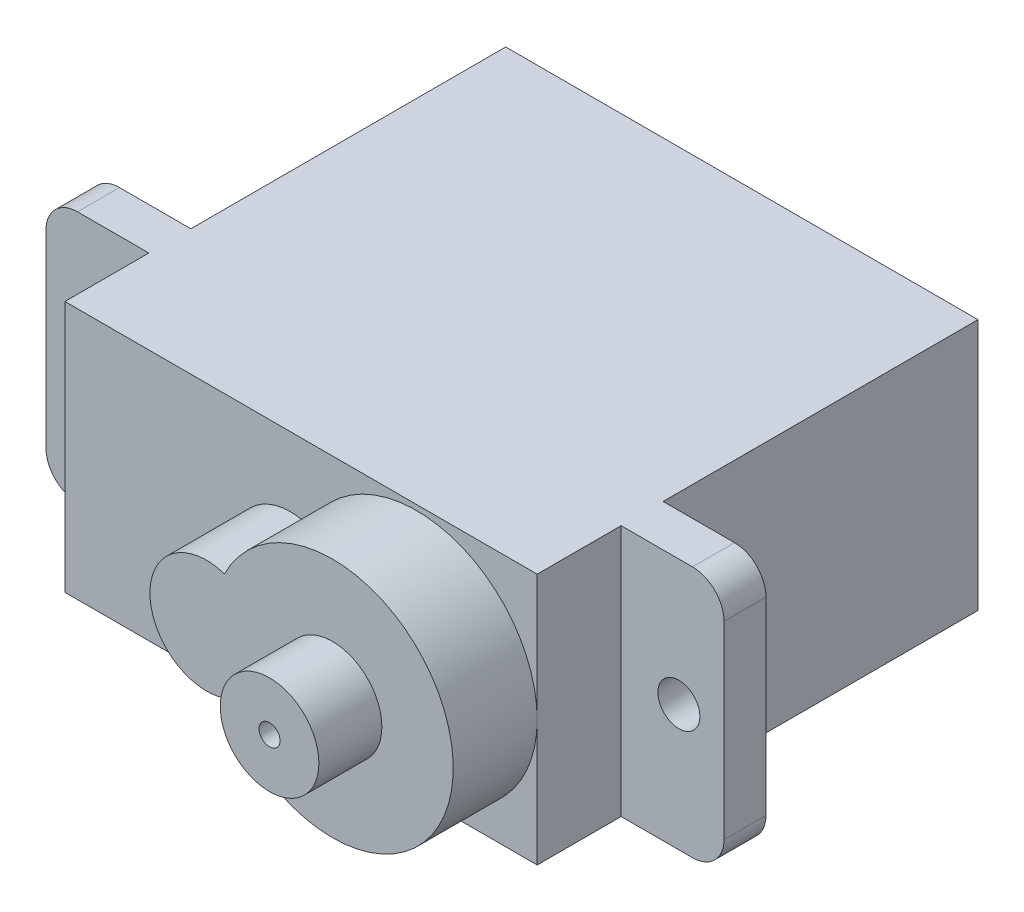
ISO-10303-21;
HEADER;
FILE_DESCRIPTION(('STEP AP214'),'2;1');
FILE_NAME('part.step','',(''),(''),'','','');
FILE_SCHEMA(('AUTOMOTIVE_DESIGN { 1 0 10303 214 1 1 1 1 }'));
ENDSEC;
DATA;
#1=APPLICATION_CONTEXT('core data for automotive mechanical design processes');
#2=APPLICATION_PROTOCOL_DEFINITION('international standard','automotive_design',2000,#1);
#3=PRODUCT_CONTEXT('',#1,'mechanical');
#4=PRODUCT('Part','Part','',(#3));
#5=PRODUCT_RELATED_PRODUCT_CATEGORY('part','',(#4));
#6=PRODUCT_DEFINITION_FORMATION('','',#4);
#7=PRODUCT_DEFINITION_CONTEXT('part definition',#1,'design');
#8=PRODUCT_DEFINITION('design','',#6,#7);
#9=PRODUCT_DEFINITION_SHAPE('','',#8);
#10=(LENGTH_UNIT() NAMED_UNIT(*) SI_UNIT(.MILLI.,.METRE.));
#11=(NAMED_UNIT(*) PLANE_ANGLE_UNIT() SI_UNIT($,.RADIAN.));
#12=(NAMED_UNIT(*) SI_UNIT($,.STERADIAN.) SOLID_ANGLE_UNIT());
#13=UNCERTAINTY_MEASURE_WITH_UNIT(LENGTH_MEASURE(1.E-05),#10,'distance_accuracy_value','');
#14=(GEOMETRIC_REPRESENTATION_CONTEXT(3) GLOBAL_UNCERTAINTY_ASSIGNED_CONTEXT((#13)) GLOBAL_UNIT_ASSIGNED_CONTEXT((#10,
#11,#12)) REPRESENTATION_CONTEXT('',''));
#15=CARTESIAN_POINT('',(0.,0.,0.));
#16=DIRECTION('',(0.,0.,1.));
#17=DIRECTION('',(1.,0.,0.));
#18=AXIS2_PLACEMENT_3D('',#15,#16,#17);
#19=CARTESIAN_POINT('',(-11.25,6.,10.5));
#20=DIRECTION('',(0.,0.,-1.));
#21=DIRECTION('',(-1.,0.,0.));
#22=AXIS2_PLACEMENT_3D('',#19,#20,#21);
#23=PLANE('',#22);
#24=CARTESIAN_POINT('',(-0.5,0.,10.5));
#25=DIRECTION('',(0.,0.,1.));
#26=DIRECTION('',(1.,0.,0.));
#27=AXIS2_PLACEMENT_3D('',#24,#25,#26);
#28=CIRCLE('',#27,2.7);
#29=CARTESIAN_POINT('',(0.352291666666666,2.5619521687437,10.5));
#30=VERTEX_POINT('',#29);
#31=CARTESIAN_POINT('',(0.352291666666666,-2.5619521687437,10.5));
#32=VERTEX_POINT('',#31);
#33=EDGE_CURVE('E171',#30,#32,#28,.T.);
#34=ORIENTED_EDGE('',*,*,#33,.F.);
#35=CARTESIAN_POINT('',(5.5,0.,10.5));
#36=DIRECTION('',(0.,0.,1.));
#37=DIRECTION('',(1.,0.,0.));
#38=AXIS2_PLACEMENT_3D('',#35,#36,#37);
#39=CIRCLE('',#38,5.75);
#40=CARTESIAN_POINT('',(11.25,0.,10.5));
#41=VERTEX_POINT('',#40);
#42=EDGE_CURVE('E178',#41,#30,#39,.T.);
#43=ORIENTED_EDGE('',*,*,#42,.F.);
#44=DIRECTION('',(0.,-1.,0.));
#45=VECTOR('',#44,1.);
#46=CARTESIAN_POINT('',(11.25,6.,10.5));
#47=LINE('',#46,#45);
#48=CARTESIAN_POINT('',(11.25,6.,10.5));
#49=VERTEX_POINT('',#48);
#50=EDGE_CURVE('E248',#49,#41,#47,.T.);
#51=ORIENTED_EDGE('',*,*,#50,.F.);
#52=DIRECTION('',(1.,0.,0.));
#53=VECTOR('',#52,1.);
#54=CARTESIAN_POINT('',(-11.25,6.,10.5));
#55=LINE('',#54,#53);
#56=CARTESIAN_POINT('',(-11.25,6.,10.5));
#57=VERTEX_POINT('',#56);
#58=EDGE_CURVE('E209',#57,#49,#55,.T.);
#59=ORIENTED_EDGE('',*,*,#58,.F.);
#60=DIRECTION('',(0.,-1.,0.));
#61=VECTOR('',#60,1.);
#62=CARTESIAN_POINT('',(-11.25,6.,10.5));
#63=LINE('',#62,#61);
#64=CARTESIAN_POINT('',(-11.25,-6.,10.5));
#65=VERTEX_POINT('',#64);
#66=EDGE_CURVE('E251',#57,#65,#63,.T.);
#67=ORIENTED_EDGE('',*,*,#66,.T.);
#68=DIRECTION('',(1.,0.,0.));
#69=VECTOR('',#68,1.);
#70=CARTESIAN_POINT('',(-11.25,-6.,10.5));
#71=LINE('',#70,#69);
#72=CARTESIAN_POINT('',(11.25,-6.,10.5));
#73=VERTEX_POINT('',#72);
#74=EDGE_CURVE('E229',#65,#73,#71,.T.);
#75=ORIENTED_EDGE('',*,*,#74,.T.);
#76=EDGE_CURVE('E247',#41,#73,#47,.T.);
#77=ORIENTED_EDGE('',*,*,#76,.F.);
#78=EDGE_CURVE('E188',#32,#41,#39,.T.);
#79=ORIENTED_EDGE('',*,*,#78,.F.);
#80=EDGE_LOOP('',(#34,#43,#51,#59,#67,#75,#77,#79));
#81=FACE_BOUND('',#80,.T.);
#82=ADVANCED_FACE('F33',(#81),#23,.F.);
#83=CARTESIAN_POINT('',(5.5,0.,14.5));
#84=DIRECTION('',(0.,0.,-1.));
#85=DIRECTION('',(-1.,0.,0.));
#86=AXIS2_PLACEMENT_3D('',#83,#84,#85);
#87=CYLINDRICAL_SURFACE('',#86,5.75);
#88=DIRECTION('',(0.,0.,-1.));
#89=VECTOR('',#88,1.);
#90=CARTESIAN_POINT('',(0.352291666666666,2.5619521687437,12.5));
#91=LINE('',#90,#89);
#92=CARTESIAN_POINT('',(0.352291666666666,2.5619521687437,14.5));
#93=VERTEX_POINT('',#92);
#94=EDGE_CURVE('E163',#93,#30,#91,.T.);
#95=ORIENTED_EDGE('',*,*,#94,.F.);
#96=CARTESIAN_POINT('',(5.5,0.,14.5));
#97=DIRECTION('',(0.,0.,1.));
#98=DIRECTION('',(1.,0.,0.));
#99=AXIS2_PLACEMENT_3D('',#96,#97,#98);
#100=CIRCLE('',#99,5.75);
#101=CARTESIAN_POINT('',(0.352291666666666,-2.5619521687437,14.5));
#102=VERTEX_POINT('',#101);
#103=EDGE_CURVE('E176',#102,#93,#100,.T.);
#104=ORIENTED_EDGE('',*,*,#103,.F.);
#105=DIRECTION('',(0.,0.,-1.));
#106=VECTOR('',#105,1.);
#107=CARTESIAN_POINT('',(0.352291666666666,-2.5619521687437,12.5));
#108=LINE('',#107,#106);
#109=EDGE_CURVE('E166',#32,#102,#108,.F.);
#110=ORIENTED_EDGE('',*,*,#109,.F.);
#111=ORIENTED_EDGE('',*,*,#78,.T.);
#112=ORIENTED_EDGE('',*,*,#42,.T.);
#113=EDGE_LOOP('',(#95,#104,#110,#111,#112));
#114=FACE_BOUND('',#113,.T.);
#115=ADVANCED_FACE('F175',(#114),#87,.T.);
#116=CARTESIAN_POINT('',(5.5,0.,14.5));
#117=DIRECTION('',(0.,0.,1.));
#118=DIRECTION('',(1.,0.,0.));
#119=AXIS2_PLACEMENT_3D('',#116,#117,#118);
#120=PLANE('',#119);
#121=CARTESIAN_POINT('',(-0.5,0.,14.5));
#122=DIRECTION('',(0.,0.,1.));
#123=DIRECTION('',(1.,0.,0.));
#124=AXIS2_PLACEMENT_3D('',#121,#122,#123);
#125=CIRCLE('',#124,2.7);
#126=EDGE_CURVE('E160',#93,#102,#125,.T.);
#127=ORIENTED_EDGE('',*,*,#126,.T.);
#128=ORIENTED_EDGE('',*,*,#103,.T.);
#129=EDGE_LOOP('',(#127,#128));
#130=FACE_BOUND('',#129,.T.);
#131=CARTESIAN_POINT('',(5.5,0.,14.5));
#132=DIRECTION('',(0.,0.,1.));
#133=DIRECTION('',(1.,0.,0.));
#134=AXIS2_PLACEMENT_3D('',#131,#132,#133);
#135=CIRCLE('',#134,2.35);
#136=CARTESIAN_POINT('',(7.85,0.,14.5));
#137=VERTEX_POINT('',#136);
#138=EDGE_CURVE('E191',#137,#137,#135,.T.);
#139=ORIENTED_EDGE('',*,*,#138,.F.);
#140=EDGE_LOOP('',(#139));
#141=FACE_BOUND('',#140,.T.);
#142=ADVANCED_FACE('F181',(#130,#141),#120,.T.);
#143=CARTESIAN_POINT('',(11.25,6.,4.5));
#144=DIRECTION('',(-1.,0.,0.));
#145=DIRECTION('',(0.,0.,1.));
#146=AXIS2_PLACEMENT_3D('',#143,#144,#145);
#147=PLANE('',#146);
#148=DIRECTION('',(0.,0.,-1.));
#149=VECTOR('',#148,1.);
#150=CARTESIAN_POINT('',(11.25,-6.,4.5));
#151=LINE('',#150,#149);
#152=CARTESIAN_POINT('',(11.25,-6.,4.5));
#153=VERTEX_POINT('',#152);
#154=CARTESIAN_POINT('',(11.25,-6.,-10.5));
#155=VERTEX_POINT('',#154);
#156=EDGE_CURVE('E183',#153,#155,#151,.T.);
#157=ORIENTED_EDGE('',*,*,#156,.T.);
#158=DIRECTION('',(0.,-1.,0.));
#159=VECTOR('',#158,1.);
#160=CARTESIAN_POINT('',(11.25,6.,-10.5));
#161=LINE('',#160,#159);
#162=CARTESIAN_POINT('',(11.25,6.,-10.5));
#163=VERTEX_POINT('',#162);
#164=EDGE_CURVE('E269',#163,#155,#161,.T.);
#165=ORIENTED_EDGE('',*,*,#164,.F.);
#166=DIRECTION('',(0.,0.,-1.));
#167=VECTOR('',#166,1.);
#168=CARTESIAN_POINT('',(11.25,6.,4.5));
#169=LINE('',#168,#167);
#170=CARTESIAN_POINT('',(11.25,6.,4.5));
#171=VERTEX_POINT('',#170);
#172=EDGE_CURVE('E194',#171,#163,#169,.T.);
#173=ORIENTED_EDGE('',*,*,#172,.F.);
#174=DIRECTION('',(0.,-1.,0.));
#175=VECTOR('',#174,1.);
#176=CARTESIAN_POINT('',(11.25,6.,4.5));
#177=LINE('',#176,#175);
#178=EDGE_CURVE('E217',#171,#153,#177,.T.);
#179=ORIENTED_EDGE('',*,*,#178,.T.);
#180=EDGE_LOOP('',(#157,#165,#173,#179));
#181=FACE_BOUND('',#180,.T.);
#182=ADVANCED_FACE('F376',(#181),#147,.F.);
#183=CARTESIAN_POINT('',(11.25,6.,-10.5));
#184=DIRECTION('',(0.,0.,1.));
#185=DIRECTION('',(1.,0.,0.));
#186=AXIS2_PLACEMENT_3D('',#183,#184,#185);
#187=PLANE('',#186);
#188=DIRECTION('',(-1.,0.,0.));
#189=VECTOR('',#188,1.);
#190=CARTESIAN_POINT('',(11.25,-6.,-10.5));
#191=LINE('',#190,#189);
#192=CARTESIAN_POINT('',(-11.25,-6.,-10.5));
#193=VERTEX_POINT('',#192);
#194=EDGE_CURVE('E186',#155,#193,#191,.T.);
#195=ORIENTED_EDGE('',*,*,#194,.T.);
#196=DIRECTION('',(0.,-1.,0.));
#197=VECTOR('',#196,1.);
#198=CARTESIAN_POINT('',(-11.25,6.,-10.5));
#199=LINE('',#198,#197);
#200=CARTESIAN_POINT('',(-11.25,6.,-10.5));
#201=VERTEX_POINT('',#200);
#202=EDGE_CURVE('E266',#201,#193,#199,.T.);
#203=ORIENTED_EDGE('',*,*,#202,.F.);
#204=DIRECTION('',(-1.,0.,0.));
#205=VECTOR('',#204,1.);
#206=CARTESIAN_POINT('',(11.25,6.,-10.5));
#207=LINE('',#206,#205);
#208=EDGE_CURVE('E197',#163,#201,#207,.T.);
#209=ORIENTED_EDGE('',*,*,#208,.F.);
#210=ORIENTED_EDGE('',*,*,#164,.T.);
#211=EDGE_LOOP('',(#195,#203,#209,#210));
#212=FACE_BOUND('',#211,.T.);
#213=ADVANCED_FACE('F372',(#212),#187,.F.);
#214=CARTESIAN_POINT('',(-11.25,6.,-10.5));
#215=DIRECTION('',(1.,0.,0.));
#216=DIRECTION('',(0.,0.,-1.));
#217=AXIS2_PLACEMENT_3D('',#214,#215,#216);
#218=PLANE('',#217);
#219=DIRECTION('',(0.,0.,1.));
#220=VECTOR('',#219,1.);
#221=CARTESIAN_POINT('',(-11.25,-6.,-10.5));
#222=LINE('',#221,#220);
#223=CARTESIAN_POINT('',(-11.25,-6.,4.5));
#224=VERTEX_POINT('',#223);
#225=EDGE_CURVE('E220',#193,#224,#222,.T.);
#226=ORIENTED_EDGE('',*,*,#225,.T.);
#227=DIRECTION('',(0.,-1.,0.));
#228=VECTOR('',#227,1.);
#229=CARTESIAN_POINT('',(-11.25,6.,4.5));
#230=LINE('',#229,#228);
#231=CARTESIAN_POINT('',(-11.25,6.,4.5));
#232=VERTEX_POINT('',#231);
#233=EDGE_CURVE('E263',#232,#224,#230,.T.);
#234=ORIENTED_EDGE('',*,*,#233,.F.);
#235=DIRECTION('',(0.,0.,1.));
#236=VECTOR('',#235,1.);
#237=CARTESIAN_POINT('',(-11.25,6.,-10.5));
#238=LINE('',#237,#236);
#239=EDGE_CURVE('E200',#201,#232,#238,.T.);
#240=ORIENTED_EDGE('',*,*,#239,.F.);
#241=ORIENTED_EDGE('',*,*,#202,.T.);
#242=EDGE_LOOP('',(#226,#234,#240,#241));
#243=FACE_BOUND('',#242,.T.);
#244=ADVANCED_FACE('F368',(#243),#218,.F.);
#245=CARTESIAN_POINT('',(-11.25,6.,4.5));
#246=DIRECTION('',(0.,0.,1.));
#247=DIRECTION('',(1.,0.,0.));
#248=AXIS2_PLACEMENT_3D('',#245,#246,#247);
#249=PLANE('',#248);
#250=CARTESIAN_POINT('',(-14.,0.,4.5));
#251=DIRECTION('',(0.,0.,1.));
#252=DIRECTION('',(1.,0.,0.));
#253=AXIS2_PLACEMENT_3D('',#250,#251,#252);
#254=CIRCLE('',#253,1.);
#255=CARTESIAN_POINT('',(-13.,0.,4.5));
#256=VERTEX_POINT('',#255);
#257=EDGE_CURVE('E465',#256,#256,#254,.T.);
#258=ORIENTED_EDGE('',*,*,#257,.T.);
#259=EDGE_LOOP('',(#258));
#260=FACE_BOUND('',#259,.T.);
#261=DIRECTION('',(0.,-1.,0.));
#262=VECTOR('',#261,1.);
#263=CARTESIAN_POINT('',(-16.15,6.,4.5));
#264=LINE('',#263,#262);
#265=CARTESIAN_POINT('',(-16.15,4.5,4.5));
#266=VERTEX_POINT('',#265);
#267=CARTESIAN_POINT('',(-16.15,-4.5,4.5));
#268=VERTEX_POINT('',#267);
#269=EDGE_CURVE('E260',#266,#268,#264,.T.);
#270=ORIENTED_EDGE('',*,*,#269,.F.);
#271=CARTESIAN_POINT('',(-14.65,4.5,4.5));
#272=DIRECTION('',(0.,0.,1.));
#273=DIRECTION('',(1.,0.,0.));
#274=AXIS2_PLACEMENT_3D('',#271,#272,#273);
#275=CIRCLE('',#274,1.5);
#276=CARTESIAN_POINT('',(-14.65,6.,4.5));
#277=VERTEX_POINT('',#276);
#278=EDGE_CURVE('E297',#266,#277,#275,.F.);
#279=ORIENTED_EDGE('',*,*,#278,.T.);
#280=DIRECTION('',(-1.,0.,0.));
#281=VECTOR('',#280,1.);
#282=CARTESIAN_POINT('',(-11.25,6.,4.5));
#283=LINE('',#282,#281);
#284=EDGE_CURVE('E202',#232,#277,#283,.T.);
#285=ORIENTED_EDGE('',*,*,#284,.F.);
#286=ORIENTED_EDGE('',*,*,#233,.T.);
#287=DIRECTION('',(-1.,0.,0.));
#288=VECTOR('',#287,1.);
#289=CARTESIAN_POINT('',(-11.25,-6.,4.5));
#290=LINE('',#289,#288);
#291=CARTESIAN_POINT('',(-14.65,-6.,4.5));
#292=VERTEX_POINT('',#291);
#293=EDGE_CURVE('E222',#224,#292,#290,.T.);
#294=ORIENTED_EDGE('',*,*,#293,.T.);
#295=CARTESIAN_POINT('',(-14.65,-4.5,4.5));
#296=DIRECTION('',(0.,0.,1.));
#297=DIRECTION('',(1.,0.,0.));
#298=AXIS2_PLACEMENT_3D('',#295,#296,#297);
#299=CIRCLE('',#298,1.5);
#300=EDGE_CURVE('E295',#292,#268,#299,.F.);
#301=ORIENTED_EDGE('',*,*,#300,.T.);
#302=EDGE_LOOP('',(#270,#279,#285,#286,#294,#301));
#303=FACE_BOUND('',#302,.T.);
#304=ADVANCED_FACE('F364',(#260,#303),#249,.F.);
#305=CARTESIAN_POINT('',(-16.15,6.,4.5));
#306=DIRECTION('',(1.,0.,0.));
#307=DIRECTION('',(0.,0.,-1.));
#308=AXIS2_PLACEMENT_3D('',#305,#306,#307);
#309=PLANE('',#308);
#310=DIRECTION('',(0.,-1.,0.));
#311=VECTOR('',#310,1.);
#312=CARTESIAN_POINT('',(-16.15,6.,6.5));
#313=LINE('',#312,#311);
#314=CARTESIAN_POINT('',(-16.15,4.5,6.5));
#315=VERTEX_POINT('',#314);
#316=CARTESIAN_POINT('',(-16.15,-4.5,6.5));
#317=VERTEX_POINT('',#316);
#318=EDGE_CURVE('E257',#315,#317,#313,.T.);
#319=ORIENTED_EDGE('',*,*,#318,.F.);
#320=DIRECTION('',(0.,0.,1.));
#321=VECTOR('',#320,1.);
#322=CARTESIAN_POINT('',(-16.15,4.5,4.5));
#323=LINE('',#322,#321);
#324=EDGE_CURVE('E293',#315,#266,#323,.F.);
#325=ORIENTED_EDGE('',*,*,#324,.T.);
#326=ORIENTED_EDGE('',*,*,#269,.T.);
#327=DIRECTION('',(0.,0.,1.));
#328=VECTOR('',#327,1.);
#329=CARTESIAN_POINT('',(-16.15,-4.5,4.5));
#330=LINE('',#329,#328);
#331=EDGE_CURVE('E290',#268,#317,#330,.T.);
#332=ORIENTED_EDGE('',*,*,#331,.T.);
#333=EDGE_LOOP('',(#319,#325,#326,#332));
#334=FACE_BOUND('',#333,.T.);
#335=ADVANCED_FACE('F360',(#334),#309,.F.);
#336=CARTESIAN_POINT('',(-16.15,6.,6.5));
#337=DIRECTION('',(0.,0.,-1.));
#338=DIRECTION('',(-1.,0.,0.));
#339=AXIS2_PLACEMENT_3D('',#336,#337,#338);
#340=PLANE('',#339);
#341=CARTESIAN_POINT('',(-14.,0.,6.50000000000001));
#342=DIRECTION('',(0.,0.,1.));
#343=DIRECTION('',(1.,0.,0.));
#344=AXIS2_PLACEMENT_3D('',#341,#342,#343);
#345=CIRCLE('',#344,1.);
#346=CARTESIAN_POINT('',(-13.,0.,6.50000000000001));
#347=VERTEX_POINT('',#346);
#348=EDGE_CURVE('E279',#347,#347,#345,.T.);
#349=ORIENTED_EDGE('',*,*,#348,.F.);
#350=EDGE_LOOP('',(#349));
#351=FACE_BOUND('',#350,.T.);
#352=DIRECTION('',(1.,0.,0.));
#353=VECTOR('',#352,1.);
#354=CARTESIAN_POINT('',(-16.15,6.,6.5));
#355=LINE('',#354,#353);
#356=CARTESIAN_POINT('',(-14.65,6.,6.5));
#357=VERTEX_POINT('',#356);
#358=CARTESIAN_POINT('',(-11.25,6.,6.5));
#359=VERTEX_POINT('',#358);
#360=EDGE_CURVE('E205',#357,#359,#355,.T.);
#361=ORIENTED_EDGE('',*,*,#360,.F.);
#362=CARTESIAN_POINT('',(-14.65,4.5,6.5));
#363=DIRECTION('',(0.,0.,-1.));
#364=DIRECTION('',(-1.,0.,0.));
#365=AXIS2_PLACEMENT_3D('',#362,#363,#364);
#366=CIRCLE('',#365,1.5);
#367=EDGE_CURVE('E288',#357,#315,#366,.F.);
#368=ORIENTED_EDGE('',*,*,#367,.T.);
#369=ORIENTED_EDGE('',*,*,#318,.T.);
#370=CARTESIAN_POINT('',(-14.65,-4.5,6.5));
#371=DIRECTION('',(0.,0.,-1.));
#372=DIRECTION('',(-1.,0.,0.));
#373=AXIS2_PLACEMENT_3D('',#370,#371,#372);
#374=CIRCLE('',#373,1.5);
#375=CARTESIAN_POINT('',(-14.65,-6.,6.5));
#376=VERTEX_POINT('',#375);
#377=EDGE_CURVE('E286',#317,#376,#374,.F.);
#378=ORIENTED_EDGE('',*,*,#377,.T.);
#379=DIRECTION('',(1.,0.,0.));
#380=VECTOR('',#379,1.);
#381=CARTESIAN_POINT('',(-16.15,-6.,6.5));
#382=LINE('',#381,#380);
#383=CARTESIAN_POINT('',(-11.25,-6.,6.5));
#384=VERTEX_POINT('',#383);
#385=EDGE_CURVE('E225',#376,#384,#382,.T.);
#386=ORIENTED_EDGE('',*,*,#385,.T.);
#387=DIRECTION('',(0.,-1.,0.));
#388=VECTOR('',#387,1.);
#389=CARTESIAN_POINT('',(-11.25,6.,6.5));
#390=LINE('',#389,#388);
#391=EDGE_CURVE('E254',#359,#384,#390,.T.);
#392=ORIENTED_EDGE('',*,*,#391,.F.);
#393=EDGE_LOOP('',(#361,#368,#369,#378,#386,#392));
#394=FACE_BOUND('',#393,.T.);
#395=ADVANCED_FACE('F356',(#351,#394),#340,.F.);
#396=CARTESIAN_POINT('',(-11.25,6.,6.5));
#397=DIRECTION('',(1.,0.,0.));
#398=DIRECTION('',(0.,0.,-1.));
#399=AXIS2_PLACEMENT_3D('',#396,#397,#398);
#400=PLANE('',#399);
#401=DIRECTION('',(0.,0.,1.));
#402=VECTOR('',#401,1.);
#403=CARTESIAN_POINT('',(-11.25,-6.,6.5));
#404=LINE('',#403,#402);
#405=EDGE_CURVE('E227',#384,#65,#404,.T.);
#406=ORIENTED_EDGE('',*,*,#405,.T.);
#407=ORIENTED_EDGE('',*,*,#66,.F.);
#408=DIRECTION('',(0.,0.,1.));
#409=VECTOR('',#408,1.);
#410=CARTESIAN_POINT('',(-11.25,6.,6.5));
#411=LINE('',#410,#409);
#412=EDGE_CURVE('E207',#359,#57,#411,.T.);
#413=ORIENTED_EDGE('',*,*,#412,.F.);
#414=ORIENTED_EDGE('',*,*,#391,.T.);
#415=EDGE_LOOP('',(#406,#407,#413,#414));
#416=FACE_BOUND('',#415,.T.);
#417=ADVANCED_FACE('F353',(#416),#400,.F.);
#418=CARTESIAN_POINT('',(11.25,6.,10.5));
#419=DIRECTION('',(-1.,0.,0.));
#420=DIRECTION('',(0.,0.,1.));
#421=AXIS2_PLACEMENT_3D('',#418,#419,#420);
#422=PLANE('',#421);
#423=DIRECTION('',(0.,0.,-1.));
#424=VECTOR('',#423,1.);
#425=CARTESIAN_POINT('',(11.25,-6.,10.5));
#426=LINE('',#425,#424);
#427=CARTESIAN_POINT('',(11.25,-6.,6.5));
#428=VERTEX_POINT('',#427);
#429=EDGE_CURVE('E232',#73,#428,#426,.T.);
#430=ORIENTED_EDGE('',*,*,#429,.T.);
#431=DIRECTION('',(0.,-1.,0.));
#432=VECTOR('',#431,1.);
#433=CARTESIAN_POINT('',(11.25,6.,6.5));
#434=LINE('',#433,#432);
#435=CARTESIAN_POINT('',(11.25,6.,6.5));
#436=VERTEX_POINT('',#435);
#437=EDGE_CURVE('E244',#436,#428,#434,.T.);
#438=ORIENTED_EDGE('',*,*,#437,.F.);
#439=DIRECTION('',(0.,0.,-1.));
#440=VECTOR('',#439,1.);
#441=CARTESIAN_POINT('',(11.25,6.,10.5));
#442=LINE('',#441,#440);
#443=EDGE_CURVE('E211',#49,#436,#442,.T.);
#444=ORIENTED_EDGE('',*,*,#443,.F.);
#445=ORIENTED_EDGE('',*,*,#50,.T.);
#446=ORIENTED_EDGE('',*,*,#76,.T.);
#447=EDGE_LOOP('',(#430,#438,#444,#445,#446));
#448=FACE_BOUND('',#447,.T.);
#449=ADVANCED_FACE('F351',(#448),#422,.F.);
#450=CARTESIAN_POINT('',(11.25,6.,6.5));
#451=DIRECTION('',(0.,0.,-1.));
#452=DIRECTION('',(-1.,0.,0.));
#453=AXIS2_PLACEMENT_3D('',#450,#451,#452);
#454=PLANE('',#453);
#455=CARTESIAN_POINT('',(14.,0.,6.50000000000001));
#456=DIRECTION('',(0.,0.,1.));
#457=DIRECTION('',(1.,0.,0.));
#458=AXIS2_PLACEMENT_3D('',#455,#456,#457);
#459=CIRCLE('',#458,1.);
#460=CARTESIAN_POINT('',(15.,0.,6.50000000000001));
#461=VERTEX_POINT('',#460);
#462=EDGE_CURVE('E280',#461,#461,#459,.T.);
#463=ORIENTED_EDGE('',*,*,#462,.F.);
#464=EDGE_LOOP('',(#463));
#465=FACE_BOUND('',#464,.T.);
#466=DIRECTION('',(0.,-1.,0.));
#467=VECTOR('',#466,1.);
#468=CARTESIAN_POINT('',(16.15,6.,6.49999999999999));
#469=LINE('',#468,#467);
#470=CARTESIAN_POINT('',(16.15,4.5,6.49999999999999));
#471=VERTEX_POINT('',#470);
#472=CARTESIAN_POINT('',(16.15,-4.5,6.49999999999999));
#473=VERTEX_POINT('',#472);
#474=EDGE_CURVE('E242',#471,#473,#469,.T.);
#475=ORIENTED_EDGE('',*,*,#474,.F.);
#476=CARTESIAN_POINT('',(14.65,4.5,6.5));
#477=DIRECTION('',(0.,0.,-1.));
#478=DIRECTION('',(-1.,0.,0.));
#479=AXIS2_PLACEMENT_3D('',#476,#477,#478);
#480=CIRCLE('',#479,1.5);
#481=CARTESIAN_POINT('',(14.65,6.,6.5));
#482=VERTEX_POINT('',#481);
#483=EDGE_CURVE('E11',#471,#482,#480,.F.);
#484=ORIENTED_EDGE('',*,*,#483,.T.);
#485=DIRECTION('',(1.,0.,0.));
#486=VECTOR('',#485,1.);
#487=CARTESIAN_POINT('',(11.25,6.,6.5));
#488=LINE('',#487,#486);
#489=EDGE_CURVE('E213',#436,#482,#488,.T.);
#490=ORIENTED_EDGE('',*,*,#489,.F.);
#491=ORIENTED_EDGE('',*,*,#437,.T.);
#492=DIRECTION('',(1.,0.,0.));
#493=VECTOR('',#492,1.);
#494=CARTESIAN_POINT('',(11.25,-6.,6.5));
#495=LINE('',#494,#493);
#496=CARTESIAN_POINT('',(14.65,-6.,6.5));
#497=VERTEX_POINT('',#496);
#498=EDGE_CURVE('E234',#428,#497,#495,.T.);
#499=ORIENTED_EDGE('',*,*,#498,.T.);
#500=CARTESIAN_POINT('',(14.65,-4.5,6.5));
#501=DIRECTION('',(0.,0.,-1.));
#502=DIRECTION('',(-1.,0.,0.));
#503=AXIS2_PLACEMENT_3D('',#500,#501,#502);
#504=CIRCLE('',#503,1.5);
#505=EDGE_CURVE('E41',#497,#473,#504,.F.);
#506=ORIENTED_EDGE('',*,*,#505,.T.);
#507=EDGE_LOOP('',(#475,#484,#490,#491,#499,#506));
#508=FACE_BOUND('',#507,.T.);
#509=ADVANCED_FACE('F327',(#465,#508),#454,.F.);
#510=CARTESIAN_POINT('',(16.15,6.,6.49999999999999));
#511=DIRECTION('',(-1.,0.,0.));
#512=DIRECTION('',(0.,0.,1.));
#513=AXIS2_PLACEMENT_3D('',#510,#511,#512);
#514=PLANE('',#513);
#515=DIRECTION('',(0.,-1.,0.));
#516=VECTOR('',#515,1.);
#517=CARTESIAN_POINT('',(16.15,6.,4.49999999999999));
#518=LINE('',#517,#516);
#519=CARTESIAN_POINT('',(16.15,4.5,4.49999999999999));
#520=VERTEX_POINT('',#519);
#521=CARTESIAN_POINT('',(16.15,-4.5,4.49999999999999));
#522=VERTEX_POINT('',#521);
#523=EDGE_CURVE('E239',#520,#522,#518,.T.);
#524=ORIENTED_EDGE('',*,*,#523,.F.);
#525=DIRECTION('',(0.,0.,-1.));
#526=VECTOR('',#525,1.);
#527=CARTESIAN_POINT('',(16.15,4.5,6.49999999999999));
#528=LINE('',#527,#526);
#529=EDGE_CURVE('E54',#520,#471,#528,.F.);
#530=ORIENTED_EDGE('',*,*,#529,.T.);
#531=ORIENTED_EDGE('',*,*,#474,.T.);
#532=DIRECTION('',(0.,0.,-1.));
#533=VECTOR('',#532,1.);
#534=CARTESIAN_POINT('',(16.15,-4.5,6.49999999999999));
#535=LINE('',#534,#533);
#536=EDGE_CURVE('E307',#473,#522,#535,.T.);
#537=ORIENTED_EDGE('',*,*,#536,.T.);
#538=EDGE_LOOP('',(#524,#530,#531,#537));
#539=FACE_BOUND('',#538,.T.);
#540=ADVANCED_FACE('F311',(#539),#514,.F.);
#541=CARTESIAN_POINT('',(16.15,6.,4.49999999999999));
#542=DIRECTION('',(0.,0.,1.));
#543=DIRECTION('',(1.,0.,0.));
#544=AXIS2_PLACEMENT_3D('',#541,#542,#543);
#545=PLANE('',#544);
#546=CARTESIAN_POINT('',(14.,0.,4.5));
#547=DIRECTION('',(0.,0.,1.));
#548=DIRECTION('',(1.,0.,0.));
#549=AXIS2_PLACEMENT_3D('',#546,#547,#548);
#550=CIRCLE('',#549,1.);
#551=CARTESIAN_POINT('',(15.,0.,4.49999999999999));
#552=VERTEX_POINT('',#551);
#553=EDGE_CURVE('E276',#552,#552,#550,.T.);
#554=ORIENTED_EDGE('',*,*,#553,.T.);
#555=EDGE_LOOP('',(#554));
#556=FACE_BOUND('',#555,.T.);
#557=DIRECTION('',(-1.,0.,0.));
#558=VECTOR('',#557,1.);
#559=CARTESIAN_POINT('',(16.15,6.,4.49999999999999));
#560=LINE('',#559,#558);
#561=CARTESIAN_POINT('',(14.65,6.,4.5));
#562=VERTEX_POINT('',#561);
#563=EDGE_CURVE('E216',#562,#171,#560,.T.);
#564=ORIENTED_EDGE('',*,*,#563,.F.);
#565=CARTESIAN_POINT('',(14.65,4.5,4.5));
#566=DIRECTION('',(0.,0.,1.));
#567=DIRECTION('',(1.,0.,0.));
#568=AXIS2_PLACEMENT_3D('',#565,#566,#567);
#569=CIRCLE('',#568,1.5);
#570=EDGE_CURVE('E305',#562,#520,#569,.F.);
#571=ORIENTED_EDGE('',*,*,#570,.T.);
#572=ORIENTED_EDGE('',*,*,#523,.T.);
#573=CARTESIAN_POINT('',(14.65,-4.5,4.5));
#574=DIRECTION('',(0.,0.,1.));
#575=DIRECTION('',(1.,0.,0.));
#576=AXIS2_PLACEMENT_3D('',#573,#574,#575);
#577=CIRCLE('',#576,1.5);
#578=CARTESIAN_POINT('',(14.65,-6.,4.5));
#579=VERTEX_POINT('',#578);
#580=EDGE_CURVE('E303',#522,#579,#577,.F.);
#581=ORIENTED_EDGE('',*,*,#580,.T.);
#582=DIRECTION('',(-1.,0.,0.));
#583=VECTOR('',#582,1.);
#584=CARTESIAN_POINT('',(16.15,-6.,4.49999999999999));
#585=LINE('',#584,#583);
#586=EDGE_CURVE('E198',#579,#153,#585,.T.);
#587=ORIENTED_EDGE('',*,*,#586,.T.);
#588=ORIENTED_EDGE('',*,*,#178,.F.);
#589=EDGE_LOOP('',(#564,#571,#572,#581,#587,#588));
#590=FACE_BOUND('',#589,.T.);
#591=ADVANCED_FACE('F315',(#556,#590),#545,.F.);
#592=CARTESIAN_POINT('',(0.,6.,0.));
#593=DIRECTION('',(0.,1.,0.));
#594=DIRECTION('',(0.,0.,1.));
#595=AXIS2_PLACEMENT_3D('',#592,#593,#594);
#596=PLANE('',#595);
#597=ORIENTED_EDGE('',*,*,#284,.T.);
#598=DIRECTION('',(0.,0.,1.));
#599=VECTOR('',#598,1.);
#600=CARTESIAN_POINT('',(-14.65,6.,6.5));
#601=LINE('',#600,#599);
#602=EDGE_CURVE('E283',#277,#357,#601,.T.);
#603=ORIENTED_EDGE('',*,*,#602,.T.);
#604=ORIENTED_EDGE('',*,*,#360,.T.);
#605=ORIENTED_EDGE('',*,*,#412,.T.);
#606=ORIENTED_EDGE('',*,*,#58,.T.);
#607=ORIENTED_EDGE('',*,*,#443,.T.);
#608=ORIENTED_EDGE('',*,*,#489,.T.);
#609=DIRECTION('',(0.,0.,-1.));
#610=VECTOR('',#609,1.);
#611=CARTESIAN_POINT('',(14.65,6.,4.49999999999999));
#612=LINE('',#611,#610);
#613=EDGE_CURVE('E179',#482,#562,#612,.T.);
#614=ORIENTED_EDGE('',*,*,#613,.T.);
#615=ORIENTED_EDGE('',*,*,#563,.T.);
#616=ORIENTED_EDGE('',*,*,#172,.T.);
#617=ORIENTED_EDGE('',*,*,#208,.T.);
#618=ORIENTED_EDGE('',*,*,#239,.T.);
#619=EDGE_LOOP('',(#597,#603,#604,#605,#606,#607,#608,#614,#615,#616,#617,#618));
#620=FACE_BOUND('',#619,.T.);
#621=ADVANCED_FACE('F323',(#620),#596,.T.);
#622=CARTESIAN_POINT('',(0.,-6.,0.));
#623=DIRECTION('',(0.,1.,0.));
#624=DIRECTION('',(0.,0.,1.));
#625=AXIS2_PLACEMENT_3D('',#622,#623,#624);
#626=PLANE('',#625);
#627=ORIENTED_EDGE('',*,*,#385,.F.);
#628=DIRECTION('',(0.,0.,1.));
#629=VECTOR('',#628,1.);
#630=CARTESIAN_POINT('',(-14.65,-6.,0.));
#631=LINE('',#630,#629);
#632=EDGE_CURVE('E301',#376,#292,#631,.F.);
#633=ORIENTED_EDGE('',*,*,#632,.T.);
#634=ORIENTED_EDGE('',*,*,#293,.F.);
#635=ORIENTED_EDGE('',*,*,#225,.F.);
#636=ORIENTED_EDGE('',*,*,#194,.F.);
#637=ORIENTED_EDGE('',*,*,#156,.F.);
#638=ORIENTED_EDGE('',*,*,#586,.F.);
#639=DIRECTION('',(0.,0.,-1.));
#640=VECTOR('',#639,1.);
#641=CARTESIAN_POINT('',(14.65,-6.,0.));
#642=LINE('',#641,#640);
#643=EDGE_CURVE('E299',#579,#497,#642,.F.);
#644=ORIENTED_EDGE('',*,*,#643,.T.);
#645=ORIENTED_EDGE('',*,*,#498,.F.);
#646=ORIENTED_EDGE('',*,*,#429,.F.);
#647=ORIENTED_EDGE('',*,*,#74,.F.);
#648=ORIENTED_EDGE('',*,*,#405,.F.);
#649=EDGE_LOOP('',(#627,#633,#634,#635,#636,#637,#638,#644,#645,#646,#647,#648));
#650=FACE_BOUND('',#649,.T.);
#651=ADVANCED_FACE('F333',(#650),#626,.F.);
#652=CARTESIAN_POINT('',(5.5,0.,17.5));
#653=DIRECTION('',(0.,0.,1.));
#654=DIRECTION('',(1.,0.,0.));
#655=AXIS2_PLACEMENT_3D('',#652,#653,#654);
#656=PLANE('',#655);
#657=CARTESIAN_POINT('',(5.5,0.,17.5));
#658=DIRECTION('',(0.,0.,1.));
#659=DIRECTION('',(1.,0.,0.));
#660=AXIS2_PLACEMENT_3D('',#657,#658,#659);
#661=CIRCLE('',#660,2.35);
#662=CARTESIAN_POINT('',(7.85,0.,17.5));
#663=VERTEX_POINT('',#662);
#664=EDGE_CURVE('E470',#663,#663,#661,.T.);
#665=ORIENTED_EDGE('',*,*,#664,.T.);
#666=EDGE_LOOP('',(#665));
#667=FACE_BOUND('',#666,.T.);
#668=CARTESIAN_POINT('',(5.5,0.,17.5));
#669=DIRECTION('',(0.,0.,1.));
#670=DIRECTION('',(1.,0.,0.));
#671=AXIS2_PLACEMENT_3D('',#668,#669,#670);
#672=CIRCLE('',#671,0.499999999999999);
#673=CARTESIAN_POINT('',(6.,0.,17.5));
#674=VERTEX_POINT('',#673);
#675=EDGE_CURVE('E170',#674,#674,#672,.T.);
#676=ORIENTED_EDGE('',*,*,#675,.F.);
#677=EDGE_LOOP('',(#676));
#678=FACE_BOUND('',#677,.T.);
#679=ADVANCED_FACE('F430',(#667,#678),#656,.T.);
#680=CARTESIAN_POINT('',(5.5,0.,17.5));
#681=DIRECTION('',(0.,0.,-1.));
#682=DIRECTION('',(-1.,0.,0.));
#683=AXIS2_PLACEMENT_3D('',#680,#681,#682);
#684=CYLINDRICAL_SURFACE('',#683,2.35);
#685=ORIENTED_EDGE('',*,*,#664,.F.);
#686=EDGE_LOOP('',(#685));
#687=FACE_BOUND('',#686,.T.);
#688=ORIENTED_EDGE('',*,*,#138,.T.);
#689=EDGE_LOOP('',(#688));
#690=FACE_BOUND('',#689,.T.);
#691=ADVANCED_FACE('F438',(#687,#690),#684,.T.);
#692=CARTESIAN_POINT('',(5.5,0.,17.5));
#693=DIRECTION('',(0.,0.,-1.));
#694=DIRECTION('',(-1.,0.,0.));
#695=AXIS2_PLACEMENT_3D('',#692,#693,#694);
#696=CYLINDRICAL_SURFACE('',#695,0.499999999999999);
#697=ORIENTED_EDGE('',*,*,#675,.T.);
#698=EDGE_LOOP('',(#697));
#699=FACE_BOUND('',#698,.T.);
#700=CARTESIAN_POINT('',(5.5,0.,14.5));
#701=DIRECTION('',(0.,0.,1.));
#702=DIRECTION('',(1.,0.,0.));
#703=AXIS2_PLACEMENT_3D('',#700,#701,#702);
#704=CIRCLE('',#703,0.499999999999999);
#705=CARTESIAN_POINT('',(6.,0.,14.5));
#706=VERTEX_POINT('',#705);
#707=EDGE_CURVE('E272',#706,#706,#704,.F.);
#708=ORIENTED_EDGE('',*,*,#707,.T.);
#709=EDGE_LOOP('',(#708));
#710=FACE_BOUND('',#709,.T.);
#711=ADVANCED_FACE('F436',(#699,#710),#696,.F.);
#712=ORIENTED_EDGE('',*,*,#707,.F.);
#713=EDGE_LOOP('',(#712));
#714=FACE_BOUND('',#713,.T.);
#715=ADVANCED_FACE('F433',(#714),#120,.T.);
#716=CARTESIAN_POINT('',(-0.5,0.,22.1367532368147));
#717=DIRECTION('',(0.,0.,-1.));
#718=DIRECTION('',(-1.,0.,0.));
#719=AXIS2_PLACEMENT_3D('',#716,#717,#718);
#720=CYLINDRICAL_SURFACE('',#719,2.7);
#721=ORIENTED_EDGE('',*,*,#126,.F.);
#722=ORIENTED_EDGE('',*,*,#94,.T.);
#723=ORIENTED_EDGE('',*,*,#33,.T.);
#724=ORIENTED_EDGE('',*,*,#109,.T.);
#725=EDGE_LOOP('',(#721,#722,#723,#724));
#726=FACE_BOUND('',#725,.T.);
#727=ADVANCED_FACE('F162',(#726),#720,.T.);
#728=CARTESIAN_POINT('',(-14.,0.,-10.5));
#729=DIRECTION('',(0.,0.,1.));
#730=DIRECTION('',(1.,0.,0.));
#731=AXIS2_PLACEMENT_3D('',#728,#729,#730);
#732=CYLINDRICAL_SURFACE('',#731,1.);
#733=ORIENTED_EDGE('',*,*,#348,.T.);
#734=EDGE_LOOP('',(#733));
#735=FACE_BOUND('',#734,.T.);
#736=ORIENTED_EDGE('',*,*,#257,.F.);
#737=EDGE_LOOP('',(#736));
#738=FACE_BOUND('',#737,.T.);
#739=ADVANCED_FACE('F450',(#735,#738),#732,.F.);
#740=CARTESIAN_POINT('',(14.,0.,-10.5));
#741=DIRECTION('',(0.,0.,1.));
#742=DIRECTION('',(1.,0.,0.));
#743=AXIS2_PLACEMENT_3D('',#740,#741,#742);
#744=CYLINDRICAL_SURFACE('',#743,1.);
#745=ORIENTED_EDGE('',*,*,#462,.T.);
#746=EDGE_LOOP('',(#745));
#747=FACE_BOUND('',#746,.T.);
#748=ORIENTED_EDGE('',*,*,#553,.F.);
#749=EDGE_LOOP('',(#748));
#750=FACE_BOUND('',#749,.T.);
#751=ADVANCED_FACE('F384',(#747,#750),#744,.F.);
#752=CARTESIAN_POINT('',(-14.65,4.5,0.));
#753=DIRECTION('',(0.,0.,-1.));
#754=DIRECTION('',(-1.,0.,0.));
#755=AXIS2_PLACEMENT_3D('',#752,#753,#754);
#756=CYLINDRICAL_SURFACE('',#755,1.5);
#757=ORIENTED_EDGE('',*,*,#278,.F.);
#758=ORIENTED_EDGE('',*,*,#324,.F.);
#759=ORIENTED_EDGE('',*,*,#367,.F.);
#760=ORIENTED_EDGE('',*,*,#602,.F.);
#761=EDGE_LOOP('',(#757,#758,#759,#760));
#762=FACE_BOUND('',#761,.T.);
#763=ADVANCED_FACE('F381',(#762),#756,.T.);
#764=CARTESIAN_POINT('',(-14.65,-4.5,4.5));
#765=DIRECTION('',(0.,0.,1.));
#766=DIRECTION('',(1.,0.,0.));
#767=AXIS2_PLACEMENT_3D('',#764,#765,#766);
#768=CYLINDRICAL_SURFACE('',#767,1.5);
#769=ORIENTED_EDGE('',*,*,#300,.F.);
#770=ORIENTED_EDGE('',*,*,#632,.F.);
#771=ORIENTED_EDGE('',*,*,#377,.F.);
#772=ORIENTED_EDGE('',*,*,#331,.F.);
#773=EDGE_LOOP('',(#769,#770,#771,#772));
#774=FACE_BOUND('',#773,.T.);
#775=ADVANCED_FACE('F341',(#774),#768,.T.);
#776=CARTESIAN_POINT('',(14.65,4.5,0.));
#777=DIRECTION('',(0.,0.,1.));
#778=DIRECTION('',(1.,0.,0.));
#779=AXIS2_PLACEMENT_3D('',#776,#777,#778);
#780=CYLINDRICAL_SURFACE('',#779,1.5);
#781=ORIENTED_EDGE('',*,*,#483,.F.);
#782=ORIENTED_EDGE('',*,*,#529,.F.);
#783=ORIENTED_EDGE('',*,*,#570,.F.);
#784=ORIENTED_EDGE('',*,*,#613,.F.);
#785=EDGE_LOOP('',(#781,#782,#783,#784));
#786=FACE_BOUND('',#785,.T.);
#787=ADVANCED_FACE('F321',(#786),#780,.T.);
#788=CARTESIAN_POINT('',(14.65,-4.5,6.49999999999999));
#789=DIRECTION('',(0.,0.,-1.));
#790=DIRECTION('',(-1.,0.,0.));
#791=AXIS2_PLACEMENT_3D('',#788,#789,#790);
#792=CYLINDRICAL_SURFACE('',#791,1.5);
#793=ORIENTED_EDGE('',*,*,#505,.F.);
#794=ORIENTED_EDGE('',*,*,#643,.F.);
#795=ORIENTED_EDGE('',*,*,#580,.F.);
#796=ORIENTED_EDGE('',*,*,#536,.F.);
#797=EDGE_LOOP('',(#793,#794,#795,#796));
#798=FACE_BOUND('',#797,.T.);
#799=ADVANCED_FACE('F35',(#798),#792,.T.);
#800=CLOSED_SHELL('',(#82,#115,#142,#182,#213,#244,#304,#335,#395,#417,#449,#509,#540,#591,#621,
#651,#679,#691,#711,#715,#727,#739,#751,#763,#775,#787,#799));
#801=MANIFOLD_SOLID_BREP('B2',#800);
#802=ADVANCED_BREP_SHAPE_REPRESENTATION('',(#18,#801),#14);
#803=SHAPE_DEFINITION_REPRESENTATION(#9,#802);
ENDSEC;
END-ISO-10303-21;
